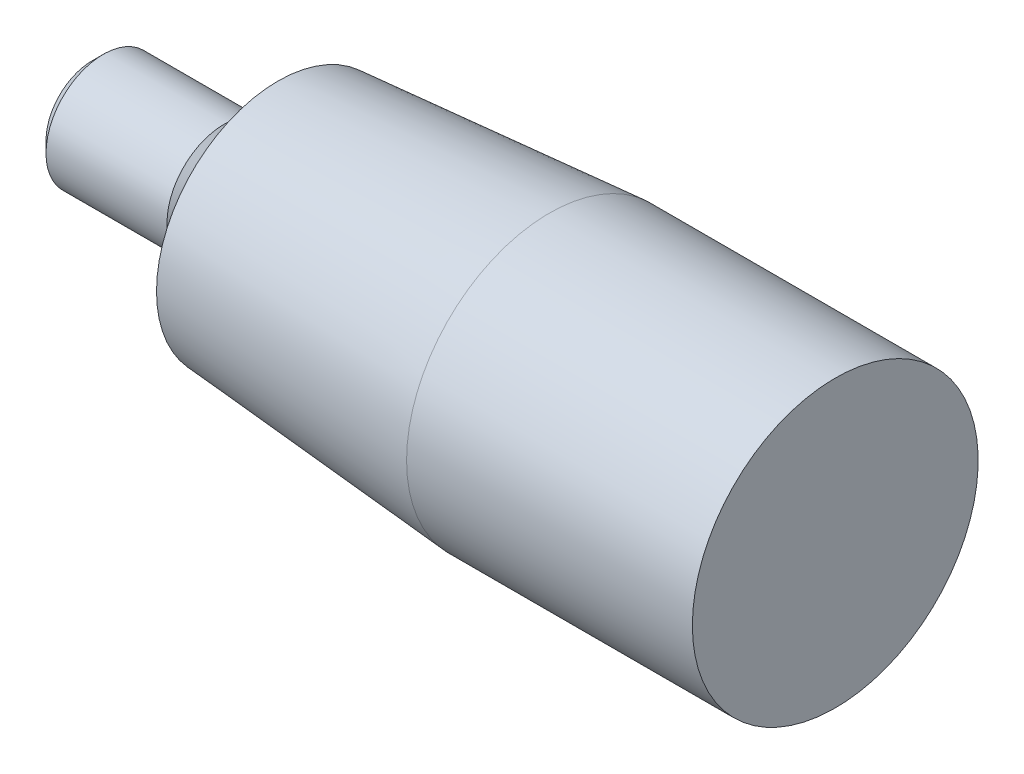
ISO-10303-21;
HEADER;
FILE_DESCRIPTION(('STEP AP214'),'2;1');
FILE_NAME('part.step','',(''),(''),'','','');
FILE_SCHEMA(('AUTOMOTIVE_DESIGN { 1 0 10303 214 1 1 1 1 }'));
ENDSEC;
DATA;
#1=APPLICATION_CONTEXT('core data for automotive mechanical design processes');
#2=APPLICATION_PROTOCOL_DEFINITION('international standard','automotive_design',2000,#1);
#3=PRODUCT_CONTEXT('',#1,'mechanical');
#4=PRODUCT('Part','Part','',(#3));
#5=PRODUCT_RELATED_PRODUCT_CATEGORY('part','',(#4));
#6=PRODUCT_DEFINITION_FORMATION('','',#4);
#7=PRODUCT_DEFINITION_CONTEXT('part definition',#1,'design');
#8=PRODUCT_DEFINITION('design','',#6,#7);
#9=PRODUCT_DEFINITION_SHAPE('','',#8);
#10=(LENGTH_UNIT() NAMED_UNIT(*) SI_UNIT(.MILLI.,.METRE.));
#11=(NAMED_UNIT(*) PLANE_ANGLE_UNIT() SI_UNIT($,.RADIAN.));
#12=(NAMED_UNIT(*) SI_UNIT($,.STERADIAN.) SOLID_ANGLE_UNIT());
#13=UNCERTAINTY_MEASURE_WITH_UNIT(LENGTH_MEASURE(1.E-05),#10,'distance_accuracy_value','');
#14=(GEOMETRIC_REPRESENTATION_CONTEXT(3) GLOBAL_UNCERTAINTY_ASSIGNED_CONTEXT((#13)) GLOBAL_UNIT_ASSIGNED_CONTEXT((#10,
#11,#12)) REPRESENTATION_CONTEXT('',''));
#15=CARTESIAN_POINT('',(0.,0.,0.));
#16=DIRECTION('',(0.,0.,1.));
#17=DIRECTION('',(1.,0.,0.));
#18=AXIS2_PLACEMENT_3D('',#15,#16,#17);
#19=CARTESIAN_POINT('',(-13.,0.,0.));
#20=DIRECTION('',(1.,0.,0.));
#21=DIRECTION('',(0.,0.,-1.));
#22=AXIS2_PLACEMENT_3D('',#19,#20,#21);
#23=PLANE('',#22);
#24=CARTESIAN_POINT('',(-13.,0.,0.));
#25=DIRECTION('',(-1.,0.,0.));
#26=DIRECTION('',(0.,0.,1.));
#27=AXIS2_PLACEMENT_3D('',#24,#25,#26);
#28=CIRCLE('',#27,3.233);
#29=CARTESIAN_POINT('',(-13.,0.,3.233));
#30=VERTEX_POINT('',#29);
#31=EDGE_CURVE('E11',#30,#30,#28,.T.);
#32=ORIENTED_EDGE('',*,*,#31,.T.);
#33=EDGE_LOOP('',(#32));
#34=FACE_BOUND('',#33,.T.);
#35=DIRECTION('',(0.,-0.5,0.866025403784439));
#36=VECTOR('',#35,1.);
#37=CARTESIAN_POINT('',(-13.,2.3094010767585,0.));
#38=LINE('',#37,#36);
#39=CARTESIAN_POINT('',(-13.,2.3094010767585,0.));
#40=VERTEX_POINT('',#39);
#41=CARTESIAN_POINT('',(-13.,1.15470053837925,2.));
#42=VERTEX_POINT('',#41);
#43=EDGE_CURVE('E49',#40,#42,#38,.T.);
#44=ORIENTED_EDGE('',*,*,#43,.T.);
#45=DIRECTION('',(0.,-1.,0.));
#46=VECTOR('',#45,1.);
#47=CARTESIAN_POINT('',(-13.,1.15470053837925,2.));
#48=LINE('',#47,#46);
#49=CARTESIAN_POINT('',(-13.,-1.15470053837925,2.));
#50=VERTEX_POINT('',#49);
#51=EDGE_CURVE('E108',#42,#50,#48,.T.);
#52=ORIENTED_EDGE('',*,*,#51,.T.);
#53=DIRECTION('',(0.,-0.5,-0.866025403784439));
#54=VECTOR('',#53,1.);
#55=CARTESIAN_POINT('',(-13.,-1.15470053837925,2.));
#56=LINE('',#55,#54);
#57=CARTESIAN_POINT('',(-13.,-2.3094010767585,0.));
#58=VERTEX_POINT('',#57);
#59=EDGE_CURVE('E106',#50,#58,#56,.T.);
#60=ORIENTED_EDGE('',*,*,#59,.T.);
#61=DIRECTION('',(0.,0.5,-0.866025403784439));
#62=VECTOR('',#61,1.);
#63=CARTESIAN_POINT('',(-13.,-2.3094010767585,0.));
#64=LINE('',#63,#62);
#65=CARTESIAN_POINT('',(-13.,-1.15470053837925,-2.));
#66=VERTEX_POINT('',#65);
#67=EDGE_CURVE('E85',#58,#66,#64,.T.);
#68=ORIENTED_EDGE('',*,*,#67,.T.);
#69=DIRECTION('',(0.,1.,0.));
#70=VECTOR('',#69,1.);
#71=CARTESIAN_POINT('',(-13.,-1.15470053837925,-2.));
#72=LINE('',#71,#70);
#73=CARTESIAN_POINT('',(-13.,1.15470053837925,-2.));
#74=VERTEX_POINT('',#73);
#75=EDGE_CURVE('E96',#66,#74,#72,.T.);
#76=ORIENTED_EDGE('',*,*,#75,.T.);
#77=DIRECTION('',(0.,0.5,0.866025403784439));
#78=VECTOR('',#77,1.);
#79=CARTESIAN_POINT('',(-13.,1.15470053837925,-2.));
#80=LINE('',#79,#78);
#81=EDGE_CURVE('E102',#74,#40,#80,.T.);
#82=ORIENTED_EDGE('',*,*,#81,.T.);
#83=EDGE_LOOP('',(#44,#52,#60,#68,#76,#82));
#84=FACE_BOUND('',#83,.T.);
#85=ADVANCED_FACE('F35',(#34,#84),#23,.F.);
#86=CARTESIAN_POINT('',(-12.233,0.,0.));
#87=DIRECTION('',(1.,0.,0.));
#88=DIRECTION('',(0.,0.,-1.));
#89=AXIS2_PLACEMENT_3D('',#86,#87,#88);
#90=CONICAL_SURFACE('',#89,4.,0.785398163397446);
#91=ORIENTED_EDGE('',*,*,#31,.F.);
#92=EDGE_LOOP('',(#91));
#93=FACE_BOUND('',#92,.T.);
#94=CARTESIAN_POINT('',(-12.233,0.,0.));
#95=DIRECTION('',(-1.,0.,0.));
#96=DIRECTION('',(0.,0.,1.));
#97=AXIS2_PLACEMENT_3D('',#94,#95,#96);
#98=CIRCLE('',#97,4.);
#99=CARTESIAN_POINT('',(-12.233,0.,4.));
#100=VERTEX_POINT('',#99);
#101=EDGE_CURVE('E42',#100,#100,#98,.T.);
#102=ORIENTED_EDGE('',*,*,#101,.T.);
#103=EDGE_LOOP('',(#102));
#104=FACE_BOUND('',#103,.T.);
#105=ADVANCED_FACE('F149',(#93,#104),#90,.T.);
#106=CARTESIAN_POINT('',(39.,0.,0.));
#107=DIRECTION('',(-1.,0.,0.));
#108=DIRECTION('',(0.,0.,1.));
#109=AXIS2_PLACEMENT_3D('',#106,#107,#108);
#110=CYLINDRICAL_SURFACE('',#109,4.);
#111=ORIENTED_EDGE('',*,*,#101,.F.);
#112=EDGE_LOOP('',(#111));
#113=FACE_BOUND('',#112,.T.);
#114=CARTESIAN_POINT('',(-3.767,0.,0.));
#115=DIRECTION('',(-1.,0.,0.));
#116=DIRECTION('',(0.,0.,1.));
#117=AXIS2_PLACEMENT_3D('',#114,#115,#116);
#118=CIRCLE('',#117,4.);
#119=CARTESIAN_POINT('',(-3.767,0.,4.));
#120=VERTEX_POINT('',#119);
#121=EDGE_CURVE('E144',#120,#120,#118,.T.);
#122=ORIENTED_EDGE('',*,*,#121,.T.);
#123=EDGE_LOOP('',(#122));
#124=FACE_BOUND('',#123,.T.);
#125=ADVANCED_FACE('F151',(#113,#124),#110,.T.);
#126=CARTESIAN_POINT('',(-3.0905,0.,0.));
#127=DIRECTION('',(-1.,0.,0.));
#128=DIRECTION('',(0.,0.,1.));
#129=AXIS2_PLACEMENT_3D('',#126,#127,#128);
#130=CONICAL_SURFACE('',#129,3.3235,0.785398163397451);
#131=ORIENTED_EDGE('',*,*,#121,.F.);
#132=EDGE_LOOP('',(#131));
#133=FACE_BOUND('',#132,.T.);
#134=CARTESIAN_POINT('',(-3.0905,0.,0.));
#135=DIRECTION('',(-1.,0.,0.));
#136=DIRECTION('',(0.,0.,1.));
#137=AXIS2_PLACEMENT_3D('',#134,#135,#136);
#138=CIRCLE('',#137,3.3235);
#139=CARTESIAN_POINT('',(-3.0905,0.,3.3235));
#140=VERTEX_POINT('',#139);
#141=EDGE_CURVE('E141',#140,#140,#138,.T.);
#142=ORIENTED_EDGE('',*,*,#141,.T.);
#143=EDGE_LOOP('',(#142));
#144=FACE_BOUND('',#143,.T.);
#145=ADVANCED_FACE('F154',(#133,#144),#130,.T.);
#146=CARTESIAN_POINT('',(39.,0.,0.));
#147=DIRECTION('',(-1.,0.,0.));
#148=DIRECTION('',(0.,0.,1.));
#149=AXIS2_PLACEMENT_3D('',#146,#147,#148);
#150=CYLINDRICAL_SURFACE('',#149,3.3235);
#151=ORIENTED_EDGE('',*,*,#141,.F.);
#152=EDGE_LOOP('',(#151));
#153=FACE_BOUND('',#152,.T.);
#154=CARTESIAN_POINT('',(-1.,0.,0.));
#155=DIRECTION('',(-1.,0.,0.));
#156=DIRECTION('',(0.,0.,1.));
#157=AXIS2_PLACEMENT_3D('',#154,#155,#156);
#158=CIRCLE('',#157,3.3235);
#159=CARTESIAN_POINT('',(-1.,0.,3.3235));
#160=VERTEX_POINT('',#159);
#161=EDGE_CURVE('E138',#160,#160,#158,.T.);
#162=ORIENTED_EDGE('',*,*,#161,.T.);
#163=EDGE_LOOP('',(#162));
#164=FACE_BOUND('',#163,.T.);
#165=ADVANCED_FACE('F160',(#153,#164),#150,.T.);
#166=CARTESIAN_POINT('',(-1.,3.3235,0.));
#167=DIRECTION('',(1.,0.,0.));
#168=DIRECTION('',(0.,0.,-1.));
#169=AXIS2_PLACEMENT_3D('',#166,#167,#168);
#170=PLANE('',#169);
#171=ORIENTED_EDGE('',*,*,#161,.F.);
#172=EDGE_LOOP('',(#171));
#173=FACE_BOUND('',#172,.T.);
#174=CARTESIAN_POINT('',(-1.,0.,0.));
#175=DIRECTION('',(-1.,0.,0.));
#176=DIRECTION('',(0.,0.,1.));
#177=AXIS2_PLACEMENT_3D('',#174,#175,#176);
#178=CIRCLE('',#177,5.);
#179=CARTESIAN_POINT('',(-1.,0.,5.));
#180=VERTEX_POINT('',#179);
#181=EDGE_CURVE('E135',#180,#180,#178,.T.);
#182=ORIENTED_EDGE('',*,*,#181,.T.);
#183=EDGE_LOOP('',(#182));
#184=FACE_BOUND('',#183,.T.);
#185=ADVANCED_FACE('F166',(#173,#184),#170,.F.);
#186=CARTESIAN_POINT('',(39.,0.,0.));
#187=DIRECTION('',(-1.,0.,0.));
#188=DIRECTION('',(0.,0.,1.));
#189=AXIS2_PLACEMENT_3D('',#186,#187,#188);
#190=CYLINDRICAL_SURFACE('',#189,5.);
#191=ORIENTED_EDGE('',*,*,#181,.F.);
#192=EDGE_LOOP('',(#191));
#193=FACE_BOUND('',#192,.T.);
#194=CARTESIAN_POINT('',(0.,0.,0.));
#195=DIRECTION('',(-1.,0.,0.));
#196=DIRECTION('',(0.,0.,1.));
#197=AXIS2_PLACEMENT_3D('',#194,#195,#196);
#198=CIRCLE('',#197,5.);
#199=CARTESIAN_POINT('',(0.,0.,5.));
#200=VERTEX_POINT('',#199);
#201=EDGE_CURVE('E132',#200,#200,#198,.T.);
#202=ORIENTED_EDGE('',*,*,#201,.T.);
#203=EDGE_LOOP('',(#202));
#204=FACE_BOUND('',#203,.T.);
#205=ADVANCED_FACE('F172',(#193,#204),#190,.T.);
#206=CARTESIAN_POINT('',(0.,5.,0.));
#207=DIRECTION('',(1.,0.,0.));
#208=DIRECTION('',(0.,0.,-1.));
#209=AXIS2_PLACEMENT_3D('',#206,#207,#208);
#210=PLANE('',#209);
#211=ORIENTED_EDGE('',*,*,#201,.F.);
#212=EDGE_LOOP('',(#211));
#213=FACE_BOUND('',#212,.T.);
#214=CARTESIAN_POINT('',(0.,0.,0.));
#215=DIRECTION('',(-1.,0.,0.));
#216=DIRECTION('',(0.,0.,1.));
#217=AXIS2_PLACEMENT_3D('',#214,#215,#216);
#218=CIRCLE('',#217,8.5);
#219=CARTESIAN_POINT('',(0.,0.,8.5));
#220=VERTEX_POINT('',#219);
#221=EDGE_CURVE('E129',#220,#220,#218,.T.);
#222=ORIENTED_EDGE('',*,*,#221,.T.);
#223=EDGE_LOOP('',(#222));
#224=FACE_BOUND('',#223,.T.);
#225=ADVANCED_FACE('F178',(#213,#224),#210,.F.);
#226=CARTESIAN_POINT('',(19.,0.,0.));
#227=DIRECTION('',(1.,0.,0.));
#228=DIRECTION('',(0.,0.,-1.));
#229=AXIS2_PLACEMENT_3D('',#226,#227,#228);
#230=CONICAL_SURFACE('',#229,10.,0.0787839609891438);
#231=ORIENTED_EDGE('',*,*,#221,.F.);
#232=EDGE_LOOP('',(#231));
#233=FACE_BOUND('',#232,.T.);
#234=CARTESIAN_POINT('',(19.,0.,0.));
#235=DIRECTION('',(-1.,0.,0.));
#236=DIRECTION('',(0.,0.,1.));
#237=AXIS2_PLACEMENT_3D('',#234,#235,#236);
#238=CIRCLE('',#237,10.);
#239=CARTESIAN_POINT('',(19.,0.,10.));
#240=VERTEX_POINT('',#239);
#241=EDGE_CURVE('E126',#240,#240,#238,.T.);
#242=ORIENTED_EDGE('',*,*,#241,.T.);
#243=EDGE_LOOP('',(#242));
#244=FACE_BOUND('',#243,.T.);
#245=ADVANCED_FACE('F184',(#233,#244),#230,.T.);
#246=CARTESIAN_POINT('',(39.,0.,0.));
#247=DIRECTION('',(-1.,0.,0.));
#248=DIRECTION('',(0.,0.,1.));
#249=AXIS2_PLACEMENT_3D('',#246,#247,#248);
#250=CYLINDRICAL_SURFACE('',#249,10.);
#251=ORIENTED_EDGE('',*,*,#241,.F.);
#252=EDGE_LOOP('',(#251));
#253=FACE_BOUND('',#252,.T.);
#254=CARTESIAN_POINT('',(39.,0.,0.));
#255=DIRECTION('',(-1.,0.,0.));
#256=DIRECTION('',(0.,0.,1.));
#257=AXIS2_PLACEMENT_3D('',#254,#255,#256);
#258=CIRCLE('',#257,10.);
#259=CARTESIAN_POINT('',(39.,0.,10.));
#260=VERTEX_POINT('',#259);
#261=EDGE_CURVE('E123',#260,#260,#258,.T.);
#262=ORIENTED_EDGE('',*,*,#261,.T.);
#263=EDGE_LOOP('',(#262));
#264=FACE_BOUND('',#263,.T.);
#265=ADVANCED_FACE('F190',(#253,#264),#250,.T.);
#266=CARTESIAN_POINT('',(39.,10.,0.));
#267=DIRECTION('',(-1.,0.,0.));
#268=DIRECTION('',(0.,0.,1.));
#269=AXIS2_PLACEMENT_3D('',#266,#267,#268);
#270=PLANE('',#269);
#271=ORIENTED_EDGE('',*,*,#261,.F.);
#272=EDGE_LOOP('',(#271));
#273=FACE_BOUND('',#272,.T.);
#274=ADVANCED_FACE('F196',(#273),#270,.F.);
#275=CARTESIAN_POINT('',(-9.,2.3094010767585,0.));
#276=DIRECTION('',(0.,-0.866025403784439,-0.5));
#277=DIRECTION('',(0.,0.5,-0.866025403784439));
#278=AXIS2_PLACEMENT_3D('',#275,#276,#277);
#279=PLANE('',#278);
#280=ORIENTED_EDGE('',*,*,#43,.F.);
#281=DIRECTION('',(-1.,0.,0.));
#282=VECTOR('',#281,1.);
#283=CARTESIAN_POINT('',(-9.,2.3094010767585,0.));
#284=LINE('',#283,#282);
#285=CARTESIAN_POINT('',(-9.,2.3094010767585,0.));
#286=VERTEX_POINT('',#285);
#287=EDGE_CURVE('E114',#286,#40,#284,.T.);
#288=ORIENTED_EDGE('',*,*,#287,.F.);
#289=DIRECTION('',(0.,-0.5,0.866025403784439));
#290=VECTOR('',#289,1.);
#291=CARTESIAN_POINT('',(-9.,2.3094010767585,0.));
#292=LINE('',#291,#290);
#293=CARTESIAN_POINT('',(-9.,1.15470053837925,2.));
#294=VERTEX_POINT('',#293);
#295=EDGE_CURVE('E113',#286,#294,#292,.T.);
#296=ORIENTED_EDGE('',*,*,#295,.T.);
#297=DIRECTION('',(-1.,0.,0.));
#298=VECTOR('',#297,1.);
#299=CARTESIAN_POINT('',(-9.,1.15470053837925,2.));
#300=LINE('',#299,#298);
#301=EDGE_CURVE('E121',#294,#42,#300,.T.);
#302=ORIENTED_EDGE('',*,*,#301,.T.);
#303=EDGE_LOOP('',(#280,#288,#296,#302));
#304=FACE_BOUND('',#303,.T.);
#305=ADVANCED_FACE('F201',(#304),#279,.T.);
#306=CARTESIAN_POINT('',(-9.,1.15470053837925,2.));
#307=DIRECTION('',(0.,0.,-1.));
#308=DIRECTION('',(-1.,0.,0.));
#309=AXIS2_PLACEMENT_3D('',#306,#307,#308);
#310=PLANE('',#309);
#311=ORIENTED_EDGE('',*,*,#51,.F.);
#312=ORIENTED_EDGE('',*,*,#301,.F.);
#313=DIRECTION('',(0.,-1.,0.));
#314=VECTOR('',#313,1.);
#315=CARTESIAN_POINT('',(-9.,1.15470053837925,2.));
#316=LINE('',#315,#314);
#317=CARTESIAN_POINT('',(-9.,-1.15470053837925,2.));
#318=VERTEX_POINT('',#317);
#319=EDGE_CURVE('E411',#294,#318,#316,.T.);
#320=ORIENTED_EDGE('',*,*,#319,.T.);
#321=DIRECTION('',(-1.,0.,0.));
#322=VECTOR('',#321,1.);
#323=CARTESIAN_POINT('',(-9.,-1.15470053837925,2.));
#324=LINE('',#323,#322);
#325=EDGE_CURVE('E119',#318,#50,#324,.T.);
#326=ORIENTED_EDGE('',*,*,#325,.T.);
#327=EDGE_LOOP('',(#311,#312,#320,#326));
#328=FACE_BOUND('',#327,.T.);
#329=ADVANCED_FACE('F206',(#328),#310,.T.);
#330=CARTESIAN_POINT('',(-9.,-1.15470053837925,2.));
#331=DIRECTION('',(0.,0.866025403784439,-0.5));
#332=DIRECTION('',(0.,0.5,0.866025403784439));
#333=AXIS2_PLACEMENT_3D('',#330,#331,#332);
#334=PLANE('',#333);
#335=ORIENTED_EDGE('',*,*,#59,.F.);
#336=ORIENTED_EDGE('',*,*,#325,.F.);
#337=DIRECTION('',(0.,-0.5,-0.866025403784439));
#338=VECTOR('',#337,1.);
#339=CARTESIAN_POINT('',(-9.,-1.15470053837925,2.));
#340=LINE('',#339,#338);
#341=CARTESIAN_POINT('',(-9.,-2.3094010767585,0.));
#342=VERTEX_POINT('',#341);
#343=EDGE_CURVE('E402',#318,#342,#340,.T.);
#344=ORIENTED_EDGE('',*,*,#343,.T.);
#345=DIRECTION('',(-1.,0.,0.));
#346=VECTOR('',#345,1.);
#347=CARTESIAN_POINT('',(-9.,-2.3094010767585,0.));
#348=LINE('',#347,#346);
#349=EDGE_CURVE('E92',#342,#58,#348,.T.);
#350=ORIENTED_EDGE('',*,*,#349,.T.);
#351=EDGE_LOOP('',(#335,#336,#344,#350));
#352=FACE_BOUND('',#351,.T.);
#353=ADVANCED_FACE('F274',(#352),#334,.T.);
#354=CARTESIAN_POINT('',(-9.,-2.3094010767585,0.));
#355=DIRECTION('',(0.,0.866025403784439,0.5));
#356=DIRECTION('',(0.,-0.5,0.866025403784439));
#357=AXIS2_PLACEMENT_3D('',#354,#355,#356);
#358=PLANE('',#357);
#359=ORIENTED_EDGE('',*,*,#67,.F.);
#360=ORIENTED_EDGE('',*,*,#349,.F.);
#361=DIRECTION('',(0.,0.5,-0.866025403784439));
#362=VECTOR('',#361,1.);
#363=CARTESIAN_POINT('',(-9.,-2.3094010767585,0.));
#364=LINE('',#363,#362);
#365=CARTESIAN_POINT('',(-9.,-1.15470053837925,-2.));
#366=VERTEX_POINT('',#365);
#367=EDGE_CURVE('E89',#342,#366,#364,.T.);
#368=ORIENTED_EDGE('',*,*,#367,.T.);
#369=DIRECTION('',(-1.,0.,0.));
#370=VECTOR('',#369,1.);
#371=CARTESIAN_POINT('',(-9.,-1.15470053837925,-2.));
#372=LINE('',#371,#370);
#373=EDGE_CURVE('E80',#366,#66,#372,.T.);
#374=ORIENTED_EDGE('',*,*,#373,.T.);
#375=EDGE_LOOP('',(#359,#360,#368,#374));
#376=FACE_BOUND('',#375,.T.);
#377=ADVANCED_FACE('F82',(#376),#358,.T.);
#378=CARTESIAN_POINT('',(-9.,-1.15470053837925,-2.));
#379=DIRECTION('',(0.,0.,1.));
#380=DIRECTION('',(1.,0.,0.));
#381=AXIS2_PLACEMENT_3D('',#378,#379,#380);
#382=PLANE('',#381);
#383=ORIENTED_EDGE('',*,*,#75,.F.);
#384=ORIENTED_EDGE('',*,*,#373,.F.);
#385=DIRECTION('',(0.,1.,0.));
#386=VECTOR('',#385,1.);
#387=CARTESIAN_POINT('',(-9.,-1.15470053837925,-2.));
#388=LINE('',#387,#386);
#389=CARTESIAN_POINT('',(-9.,1.15470053837925,-2.));
#390=VERTEX_POINT('',#389);
#391=EDGE_CURVE('E398',#366,#390,#388,.T.);
#392=ORIENTED_EDGE('',*,*,#391,.T.);
#393=DIRECTION('',(-1.,0.,0.));
#394=VECTOR('',#393,1.);
#395=CARTESIAN_POINT('',(-9.,1.15470053837925,-2.));
#396=LINE('',#395,#394);
#397=EDGE_CURVE('E93',#390,#74,#396,.T.);
#398=ORIENTED_EDGE('',*,*,#397,.T.);
#399=EDGE_LOOP('',(#383,#384,#392,#398));
#400=FACE_BOUND('',#399,.T.);
#401=ADVANCED_FACE('F97',(#400),#382,.T.);
#402=CARTESIAN_POINT('',(-9.,1.15470053837925,-2.));
#403=DIRECTION('',(0.,-0.866025403784439,0.5));
#404=DIRECTION('',(0.,-0.5,-0.866025403784439));
#405=AXIS2_PLACEMENT_3D('',#402,#403,#404);
#406=PLANE('',#405);
#407=ORIENTED_EDGE('',*,*,#81,.F.);
#408=ORIENTED_EDGE('',*,*,#397,.F.);
#409=DIRECTION('',(0.,0.5,0.866025403784439));
#410=VECTOR('',#409,1.);
#411=CARTESIAN_POINT('',(-9.,1.15470053837925,-2.));
#412=LINE('',#411,#410);
#413=EDGE_CURVE('E116',#390,#286,#412,.T.);
#414=ORIENTED_EDGE('',*,*,#413,.T.);
#415=ORIENTED_EDGE('',*,*,#287,.T.);
#416=EDGE_LOOP('',(#407,#408,#414,#415));
#417=FACE_BOUND('',#416,.T.);
#418=ADVANCED_FACE('F301',(#417),#406,.T.);
#419=CARTESIAN_POINT('',(-9.,0.,0.));
#420=DIRECTION('',(1.,0.,0.));
#421=DIRECTION('',(0.,0.,-1.));
#422=AXIS2_PLACEMENT_3D('',#419,#420,#421);
#423=PLANE('',#422);
#424=CARTESIAN_POINT('',(-9.,0.,0.));
#425=DIRECTION('',(-1.,0.,0.));
#426=DIRECTION('',(0.,0.,1.));
#427=AXIS2_PLACEMENT_3D('',#424,#425,#426);
#428=CIRCLE('',#427,2.3094010767585);
#429=EDGE_CURVE('E383',#294,#286,#428,.T.);
#430=ORIENTED_EDGE('',*,*,#429,.F.);
#431=ORIENTED_EDGE('',*,*,#295,.F.);
#432=EDGE_LOOP('',(#430,#431));
#433=FACE_BOUND('',#432,.T.);
#434=ADVANCED_FACE('F310',(#433),#423,.T.);
#435=EDGE_CURVE('E421',#286,#390,#428,.T.);
#436=ORIENTED_EDGE('',*,*,#435,.F.);
#437=ORIENTED_EDGE('',*,*,#413,.F.);
#438=EDGE_LOOP('',(#436,#437));
#439=FACE_BOUND('',#438,.T.);
#440=ADVANCED_FACE('F320',(#439),#423,.T.);
#441=EDGE_CURVE('E409',#390,#366,#428,.T.);
#442=ORIENTED_EDGE('',*,*,#441,.F.);
#443=ORIENTED_EDGE('',*,*,#391,.F.);
#444=EDGE_LOOP('',(#442,#443));
#445=FACE_BOUND('',#444,.T.);
#446=ADVANCED_FACE('F331',(#445),#423,.T.);
#447=EDGE_CURVE('E400',#366,#342,#428,.T.);
#448=ORIENTED_EDGE('',*,*,#447,.F.);
#449=ORIENTED_EDGE('',*,*,#367,.F.);
#450=EDGE_LOOP('',(#448,#449));
#451=FACE_BOUND('',#450,.T.);
#452=ADVANCED_FACE('F340',(#451),#423,.T.);
#453=EDGE_CURVE('E58',#342,#318,#428,.T.);
#454=ORIENTED_EDGE('',*,*,#453,.F.);
#455=ORIENTED_EDGE('',*,*,#343,.F.);
#456=EDGE_LOOP('',(#454,#455));
#457=FACE_BOUND('',#456,.T.);
#458=ADVANCED_FACE('F349',(#457),#423,.T.);
#459=EDGE_CURVE('E407',#318,#294,#428,.T.);
#460=ORIENTED_EDGE('',*,*,#459,.F.);
#461=ORIENTED_EDGE('',*,*,#319,.F.);
#462=EDGE_LOOP('',(#460,#461));
#463=FACE_BOUND('',#462,.T.);
#464=ADVANCED_FACE('F323',(#463),#423,.T.);
#465=CARTESIAN_POINT('',(-7.67,0.,0.));
#466=DIRECTION('',(-1.,0.,0.));
#467=DIRECTION('',(0.,0.,1.));
#468=AXIS2_PLACEMENT_3D('',#465,#466,#467);
#469=CONICAL_SURFACE('',#468,0.,1.04828075953315);
#470=ORIENTED_EDGE('',*,*,#429,.T.);
#471=ORIENTED_EDGE('',*,*,#435,.T.);
#472=ORIENTED_EDGE('',*,*,#441,.T.);
#473=ORIENTED_EDGE('',*,*,#447,.T.);
#474=ORIENTED_EDGE('',*,*,#453,.T.);
#475=ORIENTED_EDGE('',*,*,#459,.T.);
#476=EDGE_LOOP('',(#470,#471,#472,#473,#474,#475));
#477=FACE_BOUND('',#476,.T.);
#478=CARTESIAN_POINT('',(-7.67,0.,0.));
#479=VERTEX_POINT('',#478);
#480=VERTEX_LOOP('',#479);
#481=FACE_BOUND('',#480,.T.);
#482=ADVANCED_FACE('F366',(#477,#481),#469,.F.);
#483=CLOSED_SHELL('',(#85,#105,#125,#145,#165,#185,#205,#225,#245,#265,#274,#305,#329,#353,#377,
#401,#418,#434,#440,#446,#452,#458,#464,#482));
#484=MANIFOLD_SOLID_BREP('B2',#483);
#485=ADVANCED_BREP_SHAPE_REPRESENTATION('',(#18,#484),#14);
#486=SHAPE_DEFINITION_REPRESENTATION(#9,#485);
ENDSEC;
END-ISO-10303-21;
